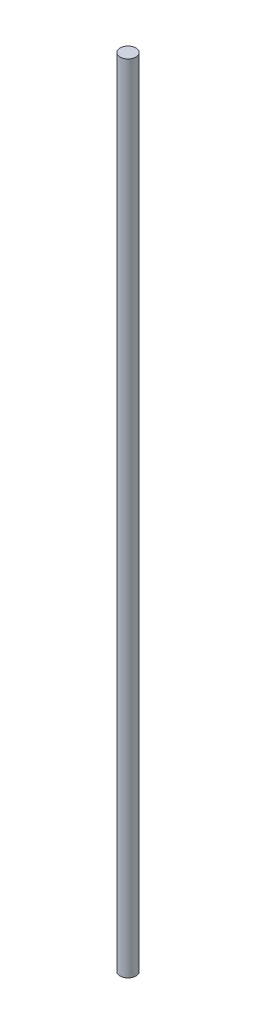
ISO-10303-21;
HEADER;
FILE_DESCRIPTION(('STEP AP214'),'2;1');
FILE_NAME('part.step','',(''),(''),'','','');
FILE_SCHEMA(('AUTOMOTIVE_DESIGN { 1 0 10303 214 1 1 1 1 }'));
ENDSEC;
DATA;
#1=APPLICATION_CONTEXT('core data for automotive mechanical design processes');
#2=APPLICATION_PROTOCOL_DEFINITION('international standard','automotive_design',2000,#1);
#3=PRODUCT_CONTEXT('',#1,'mechanical');
#4=PRODUCT('Part','Part','',(#3));
#5=PRODUCT_RELATED_PRODUCT_CATEGORY('part','',(#4));
#6=PRODUCT_DEFINITION_FORMATION('','',#4);
#7=PRODUCT_DEFINITION_CONTEXT('part definition',#1,'design');
#8=PRODUCT_DEFINITION('design','',#6,#7);
#9=PRODUCT_DEFINITION_SHAPE('','',#8);
#10=(LENGTH_UNIT() NAMED_UNIT(*) SI_UNIT(.MILLI.,.METRE.));
#11=(NAMED_UNIT(*) PLANE_ANGLE_UNIT() SI_UNIT($,.RADIAN.));
#12=(NAMED_UNIT(*) SI_UNIT($,.STERADIAN.) SOLID_ANGLE_UNIT());
#13=UNCERTAINTY_MEASURE_WITH_UNIT(LENGTH_MEASURE(1.E-05),#10,'distance_accuracy_value','');
#14=(GEOMETRIC_REPRESENTATION_CONTEXT(3) GLOBAL_UNCERTAINTY_ASSIGNED_CONTEXT((#13)) GLOBAL_UNIT_ASSIGNED_CONTEXT((#10,
#11,#12)) REPRESENTATION_CONTEXT('',''));
#15=CARTESIAN_POINT('',(0.,0.,0.));
#16=DIRECTION('',(0.,0.,1.));
#17=DIRECTION('',(1.,0.,0.));
#18=AXIS2_PLACEMENT_3D('',#15,#16,#17);
#19=CARTESIAN_POINT('',(0.,-4.5,0.));
#20=DIRECTION('',(0.,1.,0.));
#21=DIRECTION('',(0.,0.,1.));
#22=AXIS2_PLACEMENT_3D('',#19,#20,#21);
#23=CYLINDRICAL_SURFACE('',#22,0.5);
#24=CARTESIAN_POINT('',(0.,-4.5,0.));
#25=DIRECTION('',(0.,1.,0.));
#26=DIRECTION('',(0.,0.,1.));
#27=AXIS2_PLACEMENT_3D('',#24,#25,#26);
#28=CIRCLE('',#27,0.5);
#29=CARTESIAN_POINT('',(0.,-4.5,0.5));
#30=VERTEX_POINT('',#29);
#31=EDGE_CURVE('E10',#30,#30,#28,.T.);
#32=ORIENTED_EDGE('',*,*,#31,.T.);
#33=EDGE_LOOP('',(#32));
#34=FACE_BOUND('',#33,.T.);
#35=CARTESIAN_POINT('',(0.,45.5,0.));
#36=DIRECTION('',(0.,1.,0.));
#37=DIRECTION('',(0.,0.,1.));
#38=AXIS2_PLACEMENT_3D('',#35,#36,#37);
#39=CIRCLE('',#38,0.5);
#40=CARTESIAN_POINT('',(0.,45.5,0.5));
#41=VERTEX_POINT('',#40);
#42=EDGE_CURVE('E36',#41,#41,#39,.T.);
#43=ORIENTED_EDGE('',*,*,#42,.F.);
#44=EDGE_LOOP('',(#43));
#45=FACE_BOUND('',#44,.T.);
#46=ADVANCED_FACE('F30',(#34,#45),#23,.T.);
#47=CARTESIAN_POINT('',(0.,-4.5,0.));
#48=DIRECTION('',(0.,1.,0.));
#49=DIRECTION('',(0.,0.,1.));
#50=AXIS2_PLACEMENT_3D('',#47,#48,#49);
#51=PLANE('',#50);
#52=ORIENTED_EDGE('',*,*,#31,.F.);
#53=EDGE_LOOP('',(#52));
#54=FACE_BOUND('',#53,.T.);
#55=ADVANCED_FACE('F45',(#54),#51,.F.);
#56=CARTESIAN_POINT('',(0.,45.5,0.));
#57=DIRECTION('',(0.,1.,0.));
#58=DIRECTION('',(0.,0.,1.));
#59=AXIS2_PLACEMENT_3D('',#56,#57,#58);
#60=PLANE('',#59);
#61=ORIENTED_EDGE('',*,*,#42,.T.);
#62=EDGE_LOOP('',(#61));
#63=FACE_BOUND('',#62,.T.);
#64=ADVANCED_FACE('F42',(#63),#60,.T.);
#65=CLOSED_SHELL('',(#46,#55,#64));
#66=MANIFOLD_SOLID_BREP('B2',#65);
#67=ADVANCED_BREP_SHAPE_REPRESENTATION('',(#18,#66),#14);
#68=SHAPE_DEFINITION_REPRESENTATION(#9,#67);
ENDSEC;
END-ISO-10303-21;
